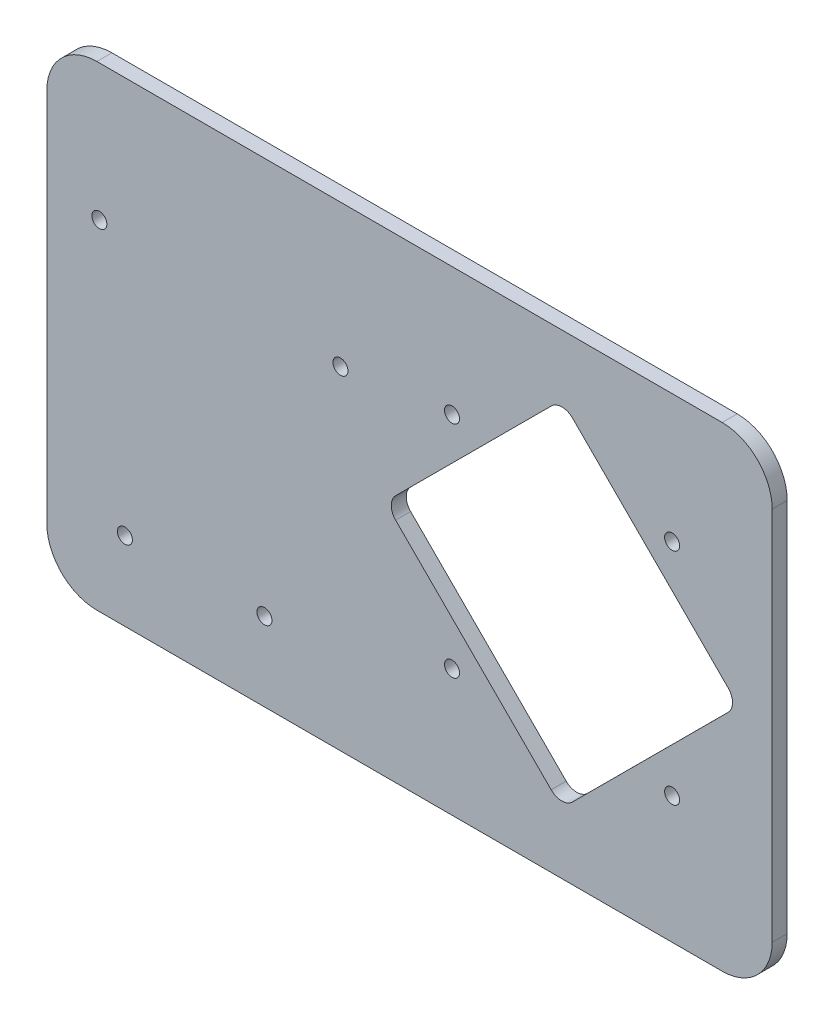
ISO-10303-21;
HEADER;
FILE_DESCRIPTION(('STEP AP214'),'2;1');
FILE_NAME('part.step','',(''),(''),'','','');
FILE_SCHEMA(('AUTOMOTIVE_DESIGN { 1 0 10303 214 1 1 1 1 }'));
ENDSEC;
DATA;
#1=APPLICATION_CONTEXT('core data for automotive mechanical design processes');
#2=APPLICATION_PROTOCOL_DEFINITION('international standard','automotive_design',2000,#1);
#3=PRODUCT_CONTEXT('',#1,'mechanical');
#4=PRODUCT('Part','Part','',(#3));
#5=PRODUCT_RELATED_PRODUCT_CATEGORY('part','',(#4));
#6=PRODUCT_DEFINITION_FORMATION('','',#4);
#7=PRODUCT_DEFINITION_CONTEXT('part definition',#1,'design');
#8=PRODUCT_DEFINITION('design','',#6,#7);
#9=PRODUCT_DEFINITION_SHAPE('','',#8);
#10=(LENGTH_UNIT() NAMED_UNIT(*) SI_UNIT(.MILLI.,.METRE.));
#11=(NAMED_UNIT(*) PLANE_ANGLE_UNIT() SI_UNIT($,.RADIAN.));
#12=(NAMED_UNIT(*) SI_UNIT($,.STERADIAN.) SOLID_ANGLE_UNIT());
#13=UNCERTAINTY_MEASURE_WITH_UNIT(LENGTH_MEASURE(1.E-05),#10,'distance_accuracy_value','');
#14=(GEOMETRIC_REPRESENTATION_CONTEXT(3) GLOBAL_UNCERTAINTY_ASSIGNED_CONTEXT((#13)) GLOBAL_UNIT_ASSIGNED_CONTEXT((#10,
#11,#12)) REPRESENTATION_CONTEXT('',''));
#15=CARTESIAN_POINT('',(0.,0.,0.));
#16=DIRECTION('',(0.,0.,1.));
#17=DIRECTION('',(1.,0.,0.));
#18=AXIS2_PLACEMENT_3D('',#15,#16,#17);
#19=CARTESIAN_POINT('',(108.521309774399,10.,3.));
#20=DIRECTION('',(0.,0.,-1.));
#21=DIRECTION('',(-1.,0.,0.));
#22=AXIS2_PLACEMENT_3D('',#19,#20,#21);
#23=CYLINDRICAL_SURFACE('',#22,10.);
#24=CARTESIAN_POINT('',(108.521309774399,10.,0.));
#25=DIRECTION('',(0.,0.,-1.));
#26=DIRECTION('',(-1.,0.,0.));
#27=AXIS2_PLACEMENT_3D('',#24,#25,#26);
#28=CIRCLE('',#27,10.);
#29=CARTESIAN_POINT('',(118.521309774399,10.,0.));
#30=VERTEX_POINT('',#29);
#31=CARTESIAN_POINT('',(108.521309774399,0.,0.));
#32=VERTEX_POINT('',#31);
#33=EDGE_CURVE('E264',#30,#32,#28,.T.);
#34=ORIENTED_EDGE('',*,*,#33,.F.);
#35=DIRECTION('',(0.,0.,-1.));
#36=VECTOR('',#35,1.);
#37=CARTESIAN_POINT('',(118.521309774399,10.,3.));
#38=LINE('',#37,#36);
#39=CARTESIAN_POINT('',(118.521309774399,10.,3.));
#40=VERTEX_POINT('',#39);
#41=EDGE_CURVE('E11',#40,#30,#38,.T.);
#42=ORIENTED_EDGE('',*,*,#41,.F.);
#43=CARTESIAN_POINT('',(108.521309774399,10.,3.));
#44=DIRECTION('',(0.,0.,-1.));
#45=DIRECTION('',(-1.,0.,0.));
#46=AXIS2_PLACEMENT_3D('',#43,#44,#45);
#47=CIRCLE('',#46,10.);
#48=CARTESIAN_POINT('',(108.521309774399,0.,3.));
#49=VERTEX_POINT('',#48);
#50=EDGE_CURVE('E267',#40,#49,#47,.T.);
#51=ORIENTED_EDGE('',*,*,#50,.T.);
#52=DIRECTION('',(0.,0.,-1.));
#53=VECTOR('',#52,1.);
#54=CARTESIAN_POINT('',(108.521309774399,0.,3.));
#55=LINE('',#54,#53);
#56=EDGE_CURVE('E40',#49,#32,#55,.T.);
#57=ORIENTED_EDGE('',*,*,#56,.T.);
#58=EDGE_LOOP('',(#34,#42,#51,#57));
#59=FACE_BOUND('',#58,.T.);
#60=ADVANCED_FACE('F37',(#59),#23,.T.);
#61=CARTESIAN_POINT('',(118.521309774399,84.99928,3.));
#62=DIRECTION('',(1.,0.,0.));
#63=DIRECTION('',(0.,0.,-1.));
#64=AXIS2_PLACEMENT_3D('',#61,#62,#63);
#65=PLANE('',#64);
#66=DIRECTION('',(0.,-1.,0.));
#67=VECTOR('',#66,1.);
#68=CARTESIAN_POINT('',(118.521309774399,84.99928,0.));
#69=LINE('',#68,#67);
#70=CARTESIAN_POINT('',(118.521309774399,84.99928,0.));
#71=VERTEX_POINT('',#70);
#72=EDGE_CURVE('E271',#71,#30,#69,.T.);
#73=ORIENTED_EDGE('',*,*,#72,.F.);
#74=DIRECTION('',(0.,0.,-1.));
#75=VECTOR('',#74,1.);
#76=CARTESIAN_POINT('',(118.521309774399,84.99928,3.));
#77=LINE('',#76,#75);
#78=CARTESIAN_POINT('',(118.521309774399,84.99928,3.));
#79=VERTEX_POINT('',#78);
#80=EDGE_CURVE('E45',#79,#71,#77,.T.);
#81=ORIENTED_EDGE('',*,*,#80,.F.);
#82=DIRECTION('',(0.,-1.,0.));
#83=VECTOR('',#82,1.);
#84=CARTESIAN_POINT('',(118.521309774399,84.99928,3.));
#85=LINE('',#84,#83);
#86=EDGE_CURVE('E289',#79,#40,#85,.T.);
#87=ORIENTED_EDGE('',*,*,#86,.T.);
#88=ORIENTED_EDGE('',*,*,#41,.T.);
#89=EDGE_LOOP('',(#73,#81,#87,#88));
#90=FACE_BOUND('',#89,.T.);
#91=ADVANCED_FACE('F336',(#90),#65,.T.);
#92=CARTESIAN_POINT('',(108.521309774399,84.99928,3.));
#93=DIRECTION('',(0.,0.,-1.));
#94=DIRECTION('',(-1.,0.,0.));
#95=AXIS2_PLACEMENT_3D('',#92,#93,#94);
#96=CYLINDRICAL_SURFACE('',#95,10.);
#97=CARTESIAN_POINT('',(108.521309774399,84.99928,0.));
#98=DIRECTION('',(0.,0.,-1.));
#99=DIRECTION('',(-1.,0.,0.));
#100=AXIS2_PLACEMENT_3D('',#97,#98,#99);
#101=CIRCLE('',#100,10.);
#102=CARTESIAN_POINT('',(108.521309774399,94.99928,0.));
#103=VERTEX_POINT('',#102);
#104=EDGE_CURVE('E309',#103,#71,#101,.T.);
#105=ORIENTED_EDGE('',*,*,#104,.F.);
#106=DIRECTION('',(0.,0.,-1.));
#107=VECTOR('',#106,1.);
#108=CARTESIAN_POINT('',(108.521309774399,94.99928,3.));
#109=LINE('',#108,#107);
#110=CARTESIAN_POINT('',(108.521309774399,94.99928,3.));
#111=VERTEX_POINT('',#110);
#112=EDGE_CURVE('E315',#111,#103,#109,.T.);
#113=ORIENTED_EDGE('',*,*,#112,.F.);
#114=CARTESIAN_POINT('',(108.521309774399,84.99928,3.));
#115=DIRECTION('',(0.,0.,-1.));
#116=DIRECTION('',(-1.,0.,0.));
#117=AXIS2_PLACEMENT_3D('',#114,#115,#116);
#118=CIRCLE('',#117,10.);
#119=EDGE_CURVE('E286',#111,#79,#118,.T.);
#120=ORIENTED_EDGE('',*,*,#119,.T.);
#121=ORIENTED_EDGE('',*,*,#80,.T.);
#122=EDGE_LOOP('',(#105,#113,#120,#121));
#123=FACE_BOUND('',#122,.T.);
#124=ADVANCED_FACE('F356',(#123),#96,.T.);
#125=CARTESIAN_POINT('',(-16.4786902256012,94.99928,3.));
#126=DIRECTION('',(0.,1.,0.));
#127=DIRECTION('',(0.,0.,1.));
#128=AXIS2_PLACEMENT_3D('',#125,#126,#127);
#129=PLANE('',#128);
#130=DIRECTION('',(1.,0.,0.));
#131=VECTOR('',#130,1.);
#132=CARTESIAN_POINT('',(-16.4786902256012,94.99928,0.));
#133=LINE('',#132,#131);
#134=CARTESIAN_POINT('',(-16.4786902256012,94.99928,0.));
#135=VERTEX_POINT('',#134);
#136=EDGE_CURVE('E306',#135,#103,#133,.T.);
#137=ORIENTED_EDGE('',*,*,#136,.F.);
#138=DIRECTION('',(0.,0.,-1.));
#139=VECTOR('',#138,1.);
#140=CARTESIAN_POINT('',(-16.4786902256012,94.99928,3.));
#141=LINE('',#140,#139);
#142=CARTESIAN_POINT('',(-16.4786902256012,94.99928,3.));
#143=VERTEX_POINT('',#142);
#144=EDGE_CURVE('E317',#143,#135,#141,.T.);
#145=ORIENTED_EDGE('',*,*,#144,.F.);
#146=DIRECTION('',(1.,0.,0.));
#147=VECTOR('',#146,1.);
#148=CARTESIAN_POINT('',(-16.4786902256012,94.99928,3.));
#149=LINE('',#148,#147);
#150=EDGE_CURVE('E283',#143,#111,#149,.T.);
#151=ORIENTED_EDGE('',*,*,#150,.T.);
#152=ORIENTED_EDGE('',*,*,#112,.T.);
#153=EDGE_LOOP('',(#137,#145,#151,#152));
#154=FACE_BOUND('',#153,.T.);
#155=ADVANCED_FACE('F354',(#154),#129,.T.);
#156=CARTESIAN_POINT('',(-16.4786902256013,84.99928,3.));
#157=DIRECTION('',(0.,0.,-1.));
#158=DIRECTION('',(-1.,0.,0.));
#159=AXIS2_PLACEMENT_3D('',#156,#157,#158);
#160=CYLINDRICAL_SURFACE('',#159,10.);
#161=CARTESIAN_POINT('',(-16.4786902256013,84.99928,0.));
#162=DIRECTION('',(0.,0.,-1.));
#163=DIRECTION('',(-1.,0.,0.));
#164=AXIS2_PLACEMENT_3D('',#161,#162,#163);
#165=CIRCLE('',#164,10.);
#166=CARTESIAN_POINT('',(-26.4786902256012,84.99928,0.));
#167=VERTEX_POINT('',#166);
#168=EDGE_CURVE('E303',#167,#135,#165,.T.);
#169=ORIENTED_EDGE('',*,*,#168,.F.);
#170=DIRECTION('',(0.,0.,-1.));
#171=VECTOR('',#170,1.);
#172=CARTESIAN_POINT('',(-26.4786902256012,84.99928,3.));
#173=LINE('',#172,#171);
#174=CARTESIAN_POINT('',(-26.4786902256012,84.99928,3.));
#175=VERTEX_POINT('',#174);
#176=EDGE_CURVE('E319',#175,#167,#173,.T.);
#177=ORIENTED_EDGE('',*,*,#176,.F.);
#178=CARTESIAN_POINT('',(-16.4786902256013,84.99928,3.));
#179=DIRECTION('',(0.,0.,-1.));
#180=DIRECTION('',(-1.,0.,0.));
#181=AXIS2_PLACEMENT_3D('',#178,#179,#180);
#182=CIRCLE('',#181,10.);
#183=EDGE_CURVE('E280',#175,#143,#182,.T.);
#184=ORIENTED_EDGE('',*,*,#183,.T.);
#185=ORIENTED_EDGE('',*,*,#144,.T.);
#186=EDGE_LOOP('',(#169,#177,#184,#185));
#187=FACE_BOUND('',#186,.T.);
#188=ADVANCED_FACE('F350',(#187),#160,.T.);
#189=CARTESIAN_POINT('',(-26.4786902256012,10.,3.));
#190=DIRECTION('',(-1.,0.,0.));
#191=DIRECTION('',(0.,0.,1.));
#192=AXIS2_PLACEMENT_3D('',#189,#190,#191);
#193=PLANE('',#192);
#194=DIRECTION('',(0.,1.,0.));
#195=VECTOR('',#194,1.);
#196=CARTESIAN_POINT('',(-26.4786902256012,10.,0.));
#197=LINE('',#196,#195);
#198=CARTESIAN_POINT('',(-26.4786902256012,10.,0.));
#199=VERTEX_POINT('',#198);
#200=EDGE_CURVE('E300',#199,#167,#197,.T.);
#201=ORIENTED_EDGE('',*,*,#200,.F.);
#202=DIRECTION('',(0.,0.,-1.));
#203=VECTOR('',#202,1.);
#204=CARTESIAN_POINT('',(-26.4786902256012,10.,3.));
#205=LINE('',#204,#203);
#206=CARTESIAN_POINT('',(-26.4786902256012,10.,3.));
#207=VERTEX_POINT('',#206);
#208=EDGE_CURVE('E321',#207,#199,#205,.T.);
#209=ORIENTED_EDGE('',*,*,#208,.F.);
#210=DIRECTION('',(0.,1.,0.));
#211=VECTOR('',#210,1.);
#212=CARTESIAN_POINT('',(-26.4786902256012,10.,3.));
#213=LINE('',#212,#211);
#214=EDGE_CURVE('E277',#207,#175,#213,.T.);
#215=ORIENTED_EDGE('',*,*,#214,.T.);
#216=ORIENTED_EDGE('',*,*,#176,.T.);
#217=EDGE_LOOP('',(#201,#209,#215,#216));
#218=FACE_BOUND('',#217,.T.);
#219=ADVANCED_FACE('F348',(#218),#193,.T.);
#220=CARTESIAN_POINT('',(-16.4786902256013,10.,3.));
#221=DIRECTION('',(0.,0.,-1.));
#222=DIRECTION('',(-1.,0.,0.));
#223=AXIS2_PLACEMENT_3D('',#220,#221,#222);
#224=CYLINDRICAL_SURFACE('',#223,10.);
#225=CARTESIAN_POINT('',(-16.4786902256013,10.,0.));
#226=DIRECTION('',(0.,0.,-1.));
#227=DIRECTION('',(-1.,0.,0.));
#228=AXIS2_PLACEMENT_3D('',#225,#226,#227);
#229=CIRCLE('',#228,10.);
#230=CARTESIAN_POINT('',(-16.4786902256013,0.,0.));
#231=VERTEX_POINT('',#230);
#232=EDGE_CURVE('E297',#231,#199,#229,.T.);
#233=ORIENTED_EDGE('',*,*,#232,.F.);
#234=DIRECTION('',(0.,0.,-1.));
#235=VECTOR('',#234,1.);
#236=CARTESIAN_POINT('',(-16.4786902256013,0.,3.));
#237=LINE('',#236,#235);
#238=CARTESIAN_POINT('',(-16.4786902256013,0.,3.));
#239=VERTEX_POINT('',#238);
#240=EDGE_CURVE('E322',#239,#231,#237,.T.);
#241=ORIENTED_EDGE('',*,*,#240,.F.);
#242=CARTESIAN_POINT('',(-16.4786902256013,10.,3.));
#243=DIRECTION('',(0.,0.,-1.));
#244=DIRECTION('',(-1.,0.,0.));
#245=AXIS2_PLACEMENT_3D('',#242,#243,#244);
#246=CIRCLE('',#245,10.);
#247=EDGE_CURVE('E274',#239,#207,#246,.T.);
#248=ORIENTED_EDGE('',*,*,#247,.T.);
#249=ORIENTED_EDGE('',*,*,#208,.T.);
#250=EDGE_LOOP('',(#233,#241,#248,#249));
#251=FACE_BOUND('',#250,.T.);
#252=ADVANCED_FACE('F344',(#251),#224,.T.);
#253=CARTESIAN_POINT('',(108.521309774399,0.,3.));
#254=DIRECTION('',(0.,-1.,0.));
#255=DIRECTION('',(0.,0.,-1.));
#256=AXIS2_PLACEMENT_3D('',#253,#254,#255);
#257=PLANE('',#256);
#258=DIRECTION('',(-1.,0.,0.));
#259=VECTOR('',#258,1.);
#260=CARTESIAN_POINT('',(108.521309774399,0.,0.));
#261=LINE('',#260,#259);
#262=EDGE_CURVE('E294',#32,#231,#261,.T.);
#263=ORIENTED_EDGE('',*,*,#262,.F.);
#264=ORIENTED_EDGE('',*,*,#56,.F.);
#265=DIRECTION('',(-1.,0.,0.));
#266=VECTOR('',#265,1.);
#267=CARTESIAN_POINT('',(108.521309774399,0.,3.));
#268=LINE('',#267,#266);
#269=EDGE_CURVE('E270',#49,#239,#268,.T.);
#270=ORIENTED_EDGE('',*,*,#269,.T.);
#271=ORIENTED_EDGE('',*,*,#240,.T.);
#272=EDGE_LOOP('',(#263,#264,#270,#271));
#273=FACE_BOUND('',#272,.T.);
#274=ADVANCED_FACE('F330',(#273),#257,.T.);
#275=CARTESIAN_POINT('',(108.521309774399,10.,3.));
#276=DIRECTION('',(0.,0.,-1.));
#277=DIRECTION('',(-1.,0.,0.));
#278=AXIS2_PLACEMENT_3D('',#275,#276,#277);
#279=PLANE('',#278);
#280=DIRECTION('',(0.706685062660328,-0.707528248349681,0.));
#281=VECTOR('',#280,1.);
#282=CARTESIAN_POINT('',(109.719554184932,49.6555218048033,3.));
#283=LINE('',#282,#281);
#284=CARTESIAN_POINT('',(78.6256123616023,80.7865635587188,3.));
#285=VERTEX_POINT('',#284);
#286=CARTESIAN_POINT('',(109.719554184932,49.6555218048033,3.));
#287=VERTEX_POINT('',#286);
#288=EDGE_CURVE('E158',#285,#287,#283,.T.);
#289=ORIENTED_EDGE('',*,*,#288,.T.);
#290=CARTESIAN_POINT('',(107.596969439883,47.5354666168224,3.));
#291=DIRECTION('',(0.,0.,-1.));
#292=DIRECTION('',(1.,0.,0.));
#293=AXIS2_PLACEMENT_3D('',#290,#291,#292);
#294=CIRCLE('',#293,2.99999999999998);
#295=CARTESIAN_POINT('',(109.717024627864,45.4128818717733,3.));
#296=VERTEX_POINT('',#295);
#297=EDGE_CURVE('E152',#287,#296,#294,.T.);
#298=ORIENTED_EDGE('',*,*,#297,.T.);
#299=DIRECTION('',(-0.707528248349681,-0.706685062660328,0.));
#300=VECTOR('',#299,1.);
#301=CARTESIAN_POINT('',(78.5857208717542,14.3186783584871,3.));
#302=LINE('',#301,#300);
#303=CARTESIAN_POINT('',(78.5857208717542,14.3186783584871,3.));
#304=VERTEX_POINT('',#303);
#305=EDGE_CURVE('E161',#296,#304,#302,.T.);
#306=ORIENTED_EDGE('',*,*,#305,.T.);
#307=CARTESIAN_POINT('',(76.4656656837732,16.4412631035361,3.));
#308=DIRECTION('',(0.,0.,-1.));
#309=DIRECTION('',(1.,0.,0.));
#310=AXIS2_PLACEMENT_3D('',#307,#308,#309);
#311=CIRCLE('',#310,3.00000000000001);
#312=CARTESIAN_POINT('',(74.3430809387241,14.3212079155551,3.));
#313=VERTEX_POINT('',#312);
#314=EDGE_CURVE('E53',#304,#313,#311,.T.);
#315=ORIENTED_EDGE('',*,*,#314,.T.);
#316=DIRECTION('',(-0.706685062660328,0.707528248349681,0.));
#317=VECTOR('',#316,1.);
#318=CARTESIAN_POINT('',(43.2491391153948,45.4522496694706,3.));
#319=LINE('',#318,#317);
#320=CARTESIAN_POINT('',(43.2491391153948,45.4522496694706,3.));
#321=VERTEX_POINT('',#320);
#322=EDGE_CURVE('E176',#313,#321,#319,.T.);
#323=ORIENTED_EDGE('',*,*,#322,.T.);
#324=CARTESIAN_POINT('',(45.3717238604438,47.5723048574516,3.));
#325=DIRECTION('',(0.,0.,-1.));
#326=DIRECTION('',(1.,0.,0.));
#327=AXIS2_PLACEMENT_3D('',#324,#325,#326);
#328=CIRCLE('',#327,3.);
#329=CARTESIAN_POINT('',(43.2516686724628,49.6948896025007,3.));
#330=VERTEX_POINT('',#329);
#331=EDGE_CURVE('E179',#321,#330,#328,.T.);
#332=ORIENTED_EDGE('',*,*,#331,.T.);
#333=DIRECTION('',(0.70752824834968,0.706685062660329,0.));
#334=VECTOR('',#333,1.);
#335=CARTESIAN_POINT('',(74.3829724285722,80.7890931157869,3.));
#336=LINE('',#335,#334);
#337=CARTESIAN_POINT('',(74.3829724285722,80.7890931157869,3.));
#338=VERTEX_POINT('',#337);
#339=EDGE_CURVE('E182',#330,#338,#336,.T.);
#340=ORIENTED_EDGE('',*,*,#339,.T.);
#341=CARTESIAN_POINT('',(76.5030276165532,78.6665083707379,3.));
#342=DIRECTION('',(0.,0.,-1.));
#343=DIRECTION('',(1.,0.,0.));
#344=AXIS2_PLACEMENT_3D('',#341,#342,#343);
#345=CIRCLE('',#344,2.99999999999998);
#346=EDGE_CURVE('E185',#338,#285,#345,.T.);
#347=ORIENTED_EDGE('',*,*,#346,.T.);
#348=EDGE_LOOP('',(#289,#298,#306,#315,#323,#332,#340,#347));
#349=FACE_BOUND('',#348,.T.);
#350=CARTESIAN_POINT('',(17.0213097743988,15.715045329957,3.));
#351=DIRECTION('',(0.,0.,-1.));
#352=DIRECTION('',(1.,0.,0.));
#353=AXIS2_PLACEMENT_3D('',#350,#351,#352);
#354=CIRCLE('',#353,1.5);
#355=CARTESIAN_POINT('',(18.5213097743988,15.715045329957,3.));
#356=VERTEX_POINT('',#355);
#357=EDGE_CURVE('E219',#356,#356,#354,.T.);
#358=ORIENTED_EDGE('',*,*,#357,.T.);
#359=EDGE_LOOP('',(#358));
#360=FACE_BOUND('',#359,.T.);
#361=CARTESIAN_POINT('',(54.5213097743988,25.375145329957,3.));
#362=DIRECTION('',(0.,0.,-1.));
#363=DIRECTION('',(1.,0.,0.));
#364=AXIS2_PLACEMENT_3D('',#361,#362,#363);
#365=CIRCLE('',#364,1.5);
#366=CARTESIAN_POINT('',(56.0213097743988,25.375145329957,3.));
#367=VERTEX_POINT('',#366);
#368=EDGE_CURVE('E225',#367,#367,#365,.T.);
#369=ORIENTED_EDGE('',*,*,#368,.T.);
#370=EDGE_LOOP('',(#369));
#371=FACE_BOUND('',#370,.T.);
#372=CARTESIAN_POINT('',(98.5203097743989,25.375145329957,3.));
#373=DIRECTION('',(0.,0.,-1.));
#374=DIRECTION('',(1.,0.,0.));
#375=AXIS2_PLACEMENT_3D('',#372,#373,#374);
#376=CIRCLE('',#375,1.5);
#377=CARTESIAN_POINT('',(100.020309774399,25.375145329957,3.));
#378=VERTEX_POINT('',#377);
#379=EDGE_CURVE('E231',#378,#378,#376,.T.);
#380=ORIENTED_EDGE('',*,*,#379,.T.);
#381=EDGE_LOOP('',(#380));
#382=FACE_BOUND('',#381,.T.);
#383=CARTESIAN_POINT('',(98.5203097743988,69.375945329957,3.));
#384=DIRECTION('',(0.,0.,-1.));
#385=DIRECTION('',(1.,0.,0.));
#386=AXIS2_PLACEMENT_3D('',#383,#384,#385);
#387=CIRCLE('',#386,1.5);
#388=CARTESIAN_POINT('',(100.020309774399,69.375945329957,3.));
#389=VERTEX_POINT('',#388);
#390=EDGE_CURVE('E237',#389,#389,#387,.T.);
#391=ORIENTED_EDGE('',*,*,#390,.T.);
#392=EDGE_LOOP('',(#391));
#393=FACE_BOUND('',#392,.T.);
#394=CARTESIAN_POINT('',(54.5213097743988,69.375945329957,3.));
#395=DIRECTION('',(0.,0.,-1.));
#396=DIRECTION('',(1.,0.,0.));
#397=AXIS2_PLACEMENT_3D('',#394,#395,#396);
#398=CIRCLE('',#397,1.5);
#399=CARTESIAN_POINT('',(56.0213097743988,69.375945329957,3.));
#400=VERTEX_POINT('',#399);
#401=EDGE_CURVE('E243',#400,#400,#398,.T.);
#402=ORIENTED_EDGE('',*,*,#401,.T.);
#403=EDGE_LOOP('',(#402));
#404=FACE_BOUND('',#403,.T.);
#405=CARTESIAN_POINT('',(-10.8786902256012,15.715045329957,3.));
#406=DIRECTION('',(0.,0.,-1.));
#407=DIRECTION('',(1.,0.,0.));
#408=AXIS2_PLACEMENT_3D('',#405,#406,#407);
#409=CIRCLE('',#408,1.5);
#410=CARTESIAN_POINT('',(-9.3786902256012,15.715045329957,3.));
#411=VERTEX_POINT('',#410);
#412=EDGE_CURVE('E249',#411,#411,#409,.T.);
#413=ORIENTED_EDGE('',*,*,#412,.T.);
#414=EDGE_LOOP('',(#413));
#415=FACE_BOUND('',#414,.T.);
#416=CARTESIAN_POINT('',(32.2203097743988,66.515245329957,3.));
#417=DIRECTION('',(0.,0.,-1.));
#418=DIRECTION('',(1.,0.,0.));
#419=AXIS2_PLACEMENT_3D('',#416,#417,#418);
#420=CIRCLE('',#419,1.5);
#421=CARTESIAN_POINT('',(33.7203097743988,66.515245329957,3.));
#422=VERTEX_POINT('',#421);
#423=EDGE_CURVE('E255',#422,#422,#420,.T.);
#424=ORIENTED_EDGE('',*,*,#423,.T.);
#425=EDGE_LOOP('',(#424));
#426=FACE_BOUND('',#425,.T.);
#427=CARTESIAN_POINT('',(-15.9786902256012,67.814545329957,3.));
#428=DIRECTION('',(0.,0.,-1.));
#429=DIRECTION('',(1.,0.,0.));
#430=AXIS2_PLACEMENT_3D('',#427,#428,#429);
#431=CIRCLE('',#430,1.5);
#432=CARTESIAN_POINT('',(-14.4786902256012,67.814545329957,3.));
#433=VERTEX_POINT('',#432);
#434=EDGE_CURVE('E261',#433,#433,#431,.T.);
#435=ORIENTED_EDGE('',*,*,#434,.T.);
#436=EDGE_LOOP('',(#435));
#437=FACE_BOUND('',#436,.T.);
#438=ORIENTED_EDGE('',*,*,#50,.F.);
#439=ORIENTED_EDGE('',*,*,#86,.F.);
#440=ORIENTED_EDGE('',*,*,#119,.F.);
#441=ORIENTED_EDGE('',*,*,#150,.F.);
#442=ORIENTED_EDGE('',*,*,#183,.F.);
#443=ORIENTED_EDGE('',*,*,#214,.F.);
#444=ORIENTED_EDGE('',*,*,#247,.F.);
#445=ORIENTED_EDGE('',*,*,#269,.F.);
#446=EDGE_LOOP('',(#438,#439,#440,#441,#442,#443,#444,#445));
#447=FACE_BOUND('',#446,.T.);
#448=ADVANCED_FACE('F165',(#349,#360,#371,#382,#393,#404,#415,#426,#437,#447),#279,.F.);
#449=CARTESIAN_POINT('',(108.521309774399,10.,0.));
#450=DIRECTION('',(0.,0.,-1.));
#451=DIRECTION('',(-1.,0.,0.));
#452=AXIS2_PLACEMENT_3D('',#449,#450,#451);
#453=PLANE('',#452);
#454=CARTESIAN_POINT('',(107.596969439883,47.5354666168224,0.));
#455=DIRECTION('',(0.,0.,-1.));
#456=DIRECTION('',(1.,0.,0.));
#457=AXIS2_PLACEMENT_3D('',#454,#455,#456);
#458=CIRCLE('',#457,2.99999999999998);
#459=CARTESIAN_POINT('',(109.719554184932,49.6555218048033,0.));
#460=VERTEX_POINT('',#459);
#461=CARTESIAN_POINT('',(109.717024627864,45.4128818717733,0.));
#462=VERTEX_POINT('',#461);
#463=EDGE_CURVE('E61',#460,#462,#458,.T.);
#464=ORIENTED_EDGE('',*,*,#463,.F.);
#465=DIRECTION('',(0.706685062660328,-0.707528248349681,0.));
#466=VECTOR('',#465,1.);
#467=CARTESIAN_POINT('',(109.719554184932,49.6555218048033,0.));
#468=LINE('',#467,#466);
#469=CARTESIAN_POINT('',(78.6256123616023,80.7865635587188,0.));
#470=VERTEX_POINT('',#469);
#471=EDGE_CURVE('E169',#470,#460,#468,.T.);
#472=ORIENTED_EDGE('',*,*,#471,.F.);
#473=CARTESIAN_POINT('',(76.5030276165532,78.6665083707379,0.));
#474=DIRECTION('',(0.,0.,-1.));
#475=DIRECTION('',(1.,0.,0.));
#476=AXIS2_PLACEMENT_3D('',#473,#474,#475);
#477=CIRCLE('',#476,2.99999999999998);
#478=CARTESIAN_POINT('',(74.3829724285722,80.7890931157869,0.));
#479=VERTEX_POINT('',#478);
#480=EDGE_CURVE('E172',#479,#470,#477,.T.);
#481=ORIENTED_EDGE('',*,*,#480,.F.);
#482=DIRECTION('',(0.70752824834968,0.706685062660329,0.));
#483=VECTOR('',#482,1.);
#484=CARTESIAN_POINT('',(74.3829724285722,80.7890931157869,0.));
#485=LINE('',#484,#483);
#486=CARTESIAN_POINT('',(43.2516686724628,49.6948896025007,0.));
#487=VERTEX_POINT('',#486);
#488=EDGE_CURVE('E200',#487,#479,#485,.T.);
#489=ORIENTED_EDGE('',*,*,#488,.F.);
#490=CARTESIAN_POINT('',(45.3717238604438,47.5723048574516,0.));
#491=DIRECTION('',(0.,0.,-1.));
#492=DIRECTION('',(1.,0.,0.));
#493=AXIS2_PLACEMENT_3D('',#490,#491,#492);
#494=CIRCLE('',#493,3.);
#495=CARTESIAN_POINT('',(43.2491391153948,45.4522496694706,0.));
#496=VERTEX_POINT('',#495);
#497=EDGE_CURVE('E197',#496,#487,#494,.T.);
#498=ORIENTED_EDGE('',*,*,#497,.F.);
#499=DIRECTION('',(-0.706685062660328,0.707528248349681,0.));
#500=VECTOR('',#499,1.);
#501=CARTESIAN_POINT('',(43.2491391153948,45.4522496694706,0.));
#502=LINE('',#501,#500);
#503=CARTESIAN_POINT('',(74.3430809387241,14.3212079155551,0.));
#504=VERTEX_POINT('',#503);
#505=EDGE_CURVE('E194',#504,#496,#502,.T.);
#506=ORIENTED_EDGE('',*,*,#505,.F.);
#507=CARTESIAN_POINT('',(76.4656656837732,16.4412631035361,0.));
#508=DIRECTION('',(0.,0.,-1.));
#509=DIRECTION('',(1.,0.,0.));
#510=AXIS2_PLACEMENT_3D('',#507,#508,#509);
#511=CIRCLE('',#510,3.00000000000001);
#512=CARTESIAN_POINT('',(78.5857208717542,14.3186783584871,0.));
#513=VERTEX_POINT('',#512);
#514=EDGE_CURVE('E191',#513,#504,#511,.T.);
#515=ORIENTED_EDGE('',*,*,#514,.F.);
#516=DIRECTION('',(-0.707528248349681,-0.706685062660328,0.));
#517=VECTOR('',#516,1.);
#518=CARTESIAN_POINT('',(78.5857208717542,14.3186783584871,0.));
#519=LINE('',#518,#517);
#520=EDGE_CURVE('E189',#462,#513,#519,.T.);
#521=ORIENTED_EDGE('',*,*,#520,.F.);
#522=EDGE_LOOP('',(#464,#472,#481,#489,#498,#506,#515,#521));
#523=FACE_BOUND('',#522,.T.);
#524=CARTESIAN_POINT('',(17.0213097743988,15.715045329957,0.));
#525=DIRECTION('',(0.,0.,-1.));
#526=DIRECTION('',(1.,0.,0.));
#527=AXIS2_PLACEMENT_3D('',#524,#525,#526);
#528=CIRCLE('',#527,1.5);
#529=CARTESIAN_POINT('',(18.5213097743988,15.715045329957,0.));
#530=VERTEX_POINT('',#529);
#531=EDGE_CURVE('E207',#530,#530,#528,.T.);
#532=ORIENTED_EDGE('',*,*,#531,.F.);
#533=EDGE_LOOP('',(#532));
#534=FACE_BOUND('',#533,.T.);
#535=CARTESIAN_POINT('',(54.5213097743988,25.375145329957,0.));
#536=DIRECTION('',(0.,0.,-1.));
#537=DIRECTION('',(1.,0.,0.));
#538=AXIS2_PLACEMENT_3D('',#535,#536,#537);
#539=CIRCLE('',#538,1.5);
#540=CARTESIAN_POINT('',(56.0213097743988,25.375145329957,0.));
#541=VERTEX_POINT('',#540);
#542=EDGE_CURVE('E222',#541,#541,#539,.T.);
#543=ORIENTED_EDGE('',*,*,#542,.F.);
#544=EDGE_LOOP('',(#543));
#545=FACE_BOUND('',#544,.T.);
#546=CARTESIAN_POINT('',(98.5203097743989,25.375145329957,0.));
#547=DIRECTION('',(0.,0.,-1.));
#548=DIRECTION('',(1.,0.,0.));
#549=AXIS2_PLACEMENT_3D('',#546,#547,#548);
#550=CIRCLE('',#549,1.5);
#551=CARTESIAN_POINT('',(100.020309774399,25.375145329957,0.));
#552=VERTEX_POINT('',#551);
#553=EDGE_CURVE('E228',#552,#552,#550,.T.);
#554=ORIENTED_EDGE('',*,*,#553,.F.);
#555=EDGE_LOOP('',(#554));
#556=FACE_BOUND('',#555,.T.);
#557=CARTESIAN_POINT('',(98.5203097743988,69.375945329957,0.));
#558=DIRECTION('',(0.,0.,-1.));
#559=DIRECTION('',(1.,0.,0.));
#560=AXIS2_PLACEMENT_3D('',#557,#558,#559);
#561=CIRCLE('',#560,1.5);
#562=CARTESIAN_POINT('',(100.020309774399,69.375945329957,0.));
#563=VERTEX_POINT('',#562);
#564=EDGE_CURVE('E234',#563,#563,#561,.T.);
#565=ORIENTED_EDGE('',*,*,#564,.F.);
#566=EDGE_LOOP('',(#565));
#567=FACE_BOUND('',#566,.T.);
#568=CARTESIAN_POINT('',(54.5213097743988,69.375945329957,0.));
#569=DIRECTION('',(0.,0.,-1.));
#570=DIRECTION('',(1.,0.,0.));
#571=AXIS2_PLACEMENT_3D('',#568,#569,#570);
#572=CIRCLE('',#571,1.5);
#573=CARTESIAN_POINT('',(56.0213097743988,69.375945329957,0.));
#574=VERTEX_POINT('',#573);
#575=EDGE_CURVE('E240',#574,#574,#572,.T.);
#576=ORIENTED_EDGE('',*,*,#575,.F.);
#577=EDGE_LOOP('',(#576));
#578=FACE_BOUND('',#577,.T.);
#579=CARTESIAN_POINT('',(-10.8786902256012,15.715045329957,0.));
#580=DIRECTION('',(0.,0.,-1.));
#581=DIRECTION('',(1.,0.,0.));
#582=AXIS2_PLACEMENT_3D('',#579,#580,#581);
#583=CIRCLE('',#582,1.5);
#584=CARTESIAN_POINT('',(-9.3786902256012,15.715045329957,0.));
#585=VERTEX_POINT('',#584);
#586=EDGE_CURVE('E246',#585,#585,#583,.T.);
#587=ORIENTED_EDGE('',*,*,#586,.F.);
#588=EDGE_LOOP('',(#587));
#589=FACE_BOUND('',#588,.T.);
#590=CARTESIAN_POINT('',(32.2203097743988,66.515245329957,0.));
#591=DIRECTION('',(0.,0.,-1.));
#592=DIRECTION('',(1.,0.,0.));
#593=AXIS2_PLACEMENT_3D('',#590,#591,#592);
#594=CIRCLE('',#593,1.5);
#595=CARTESIAN_POINT('',(33.7203097743988,66.515245329957,0.));
#596=VERTEX_POINT('',#595);
#597=EDGE_CURVE('E252',#596,#596,#594,.T.);
#598=ORIENTED_EDGE('',*,*,#597,.F.);
#599=EDGE_LOOP('',(#598));
#600=FACE_BOUND('',#599,.T.);
#601=CARTESIAN_POINT('',(-15.9786902256012,67.814545329957,0.));
#602=DIRECTION('',(0.,0.,-1.));
#603=DIRECTION('',(1.,0.,0.));
#604=AXIS2_PLACEMENT_3D('',#601,#602,#603);
#605=CIRCLE('',#604,1.5);
#606=CARTESIAN_POINT('',(-14.4786902256012,67.814545329957,0.));
#607=VERTEX_POINT('',#606);
#608=EDGE_CURVE('E258',#607,#607,#605,.T.);
#609=ORIENTED_EDGE('',*,*,#608,.F.);
#610=EDGE_LOOP('',(#609));
#611=FACE_BOUND('',#610,.T.);
#612=ORIENTED_EDGE('',*,*,#33,.T.);
#613=ORIENTED_EDGE('',*,*,#262,.T.);
#614=ORIENTED_EDGE('',*,*,#232,.T.);
#615=ORIENTED_EDGE('',*,*,#200,.T.);
#616=ORIENTED_EDGE('',*,*,#168,.T.);
#617=ORIENTED_EDGE('',*,*,#136,.T.);
#618=ORIENTED_EDGE('',*,*,#104,.T.);
#619=ORIENTED_EDGE('',*,*,#72,.T.);
#620=EDGE_LOOP('',(#612,#613,#614,#615,#616,#617,#618,#619));
#621=FACE_BOUND('',#620,.T.);
#622=ADVANCED_FACE('F332',(#523,#534,#545,#556,#567,#578,#589,#600,#611,#621),#453,.T.);
#623=CARTESIAN_POINT('',(-15.9786902256012,67.814545329957,3.));
#624=DIRECTION('',(0.,0.,-1.));
#625=DIRECTION('',(-1.,0.,0.));
#626=AXIS2_PLACEMENT_3D('',#623,#624,#625);
#627=CYLINDRICAL_SURFACE('',#626,1.5);
#628=ORIENTED_EDGE('',*,*,#434,.F.);
#629=EDGE_LOOP('',(#628));
#630=FACE_BOUND('',#629,.T.);
#631=ORIENTED_EDGE('',*,*,#608,.T.);
#632=EDGE_LOOP('',(#631));
#633=FACE_BOUND('',#632,.T.);
#634=ADVANCED_FACE('F430',(#630,#633),#627,.F.);
#635=CARTESIAN_POINT('',(32.2203097743988,66.515245329957,3.));
#636=DIRECTION('',(0.,0.,-1.));
#637=DIRECTION('',(-1.,0.,0.));
#638=AXIS2_PLACEMENT_3D('',#635,#636,#637);
#639=CYLINDRICAL_SURFACE('',#638,1.5);
#640=ORIENTED_EDGE('',*,*,#423,.F.);
#641=EDGE_LOOP('',(#640));
#642=FACE_BOUND('',#641,.T.);
#643=ORIENTED_EDGE('',*,*,#597,.T.);
#644=EDGE_LOOP('',(#643));
#645=FACE_BOUND('',#644,.T.);
#646=ADVANCED_FACE('F440',(#642,#645),#639,.F.);
#647=CARTESIAN_POINT('',(-10.8786902256012,15.715045329957,3.));
#648=DIRECTION('',(0.,0.,-1.));
#649=DIRECTION('',(-1.,0.,0.));
#650=AXIS2_PLACEMENT_3D('',#647,#648,#649);
#651=CYLINDRICAL_SURFACE('',#650,1.5);
#652=ORIENTED_EDGE('',*,*,#412,.F.);
#653=EDGE_LOOP('',(#652));
#654=FACE_BOUND('',#653,.T.);
#655=ORIENTED_EDGE('',*,*,#586,.T.);
#656=EDGE_LOOP('',(#655));
#657=FACE_BOUND('',#656,.T.);
#658=ADVANCED_FACE('F450',(#654,#657),#651,.F.);
#659=CARTESIAN_POINT('',(54.5213097743988,69.375945329957,3.));
#660=DIRECTION('',(0.,0.,-1.));
#661=DIRECTION('',(-1.,0.,0.));
#662=AXIS2_PLACEMENT_3D('',#659,#660,#661);
#663=CYLINDRICAL_SURFACE('',#662,1.5);
#664=ORIENTED_EDGE('',*,*,#401,.F.);
#665=EDGE_LOOP('',(#664));
#666=FACE_BOUND('',#665,.T.);
#667=ORIENTED_EDGE('',*,*,#575,.T.);
#668=EDGE_LOOP('',(#667));
#669=FACE_BOUND('',#668,.T.);
#670=ADVANCED_FACE('F460',(#666,#669),#663,.F.);
#671=CARTESIAN_POINT('',(98.5203097743988,69.375945329957,3.));
#672=DIRECTION('',(0.,0.,-1.));
#673=DIRECTION('',(-1.,0.,0.));
#674=AXIS2_PLACEMENT_3D('',#671,#672,#673);
#675=CYLINDRICAL_SURFACE('',#674,1.5);
#676=ORIENTED_EDGE('',*,*,#390,.F.);
#677=EDGE_LOOP('',(#676));
#678=FACE_BOUND('',#677,.T.);
#679=ORIENTED_EDGE('',*,*,#564,.T.);
#680=EDGE_LOOP('',(#679));
#681=FACE_BOUND('',#680,.T.);
#682=ADVANCED_FACE('F470',(#678,#681),#675,.F.);
#683=CARTESIAN_POINT('',(98.5203097743989,25.375145329957,3.));
#684=DIRECTION('',(0.,0.,-1.));
#685=DIRECTION('',(-1.,0.,0.));
#686=AXIS2_PLACEMENT_3D('',#683,#684,#685);
#687=CYLINDRICAL_SURFACE('',#686,1.5);
#688=ORIENTED_EDGE('',*,*,#379,.F.);
#689=EDGE_LOOP('',(#688));
#690=FACE_BOUND('',#689,.T.);
#691=ORIENTED_EDGE('',*,*,#553,.T.);
#692=EDGE_LOOP('',(#691));
#693=FACE_BOUND('',#692,.T.);
#694=ADVANCED_FACE('F480',(#690,#693),#687,.F.);
#695=CARTESIAN_POINT('',(54.5213097743988,25.375145329957,3.));
#696=DIRECTION('',(0.,0.,-1.));
#697=DIRECTION('',(-1.,0.,0.));
#698=AXIS2_PLACEMENT_3D('',#695,#696,#697);
#699=CYLINDRICAL_SURFACE('',#698,1.5);
#700=ORIENTED_EDGE('',*,*,#368,.F.);
#701=EDGE_LOOP('',(#700));
#702=FACE_BOUND('',#701,.T.);
#703=ORIENTED_EDGE('',*,*,#542,.T.);
#704=EDGE_LOOP('',(#703));
#705=FACE_BOUND('',#704,.T.);
#706=ADVANCED_FACE('F490',(#702,#705),#699,.F.);
#707=CARTESIAN_POINT('',(17.0213097743988,15.715045329957,3.));
#708=DIRECTION('',(0.,0.,-1.));
#709=DIRECTION('',(-1.,0.,0.));
#710=AXIS2_PLACEMENT_3D('',#707,#708,#709);
#711=CYLINDRICAL_SURFACE('',#710,1.5);
#712=ORIENTED_EDGE('',*,*,#357,.F.);
#713=EDGE_LOOP('',(#712));
#714=FACE_BOUND('',#713,.T.);
#715=ORIENTED_EDGE('',*,*,#531,.T.);
#716=EDGE_LOOP('',(#715));
#717=FACE_BOUND('',#716,.T.);
#718=ADVANCED_FACE('F500',(#714,#717),#711,.F.);
#719=CARTESIAN_POINT('',(107.596969439883,47.5354666168224,3.));
#720=DIRECTION('',(0.,0.,-1.));
#721=DIRECTION('',(-1.,0.,0.));
#722=AXIS2_PLACEMENT_3D('',#719,#720,#721);
#723=CYLINDRICAL_SURFACE('',#722,2.99999999999998);
#724=ORIENTED_EDGE('',*,*,#463,.T.);
#725=DIRECTION('',(0.,0.,-1.));
#726=VECTOR('',#725,1.);
#727=CARTESIAN_POINT('',(109.717024627864,45.4128818717733,3.));
#728=LINE('',#727,#726);
#729=EDGE_CURVE('E148',#296,#462,#728,.T.);
#730=ORIENTED_EDGE('',*,*,#729,.F.);
#731=ORIENTED_EDGE('',*,*,#297,.F.);
#732=DIRECTION('',(0.,0.,-1.));
#733=VECTOR('',#732,1.);
#734=CARTESIAN_POINT('',(109.719554184932,49.6555218048033,3.));
#735=LINE('',#734,#733);
#736=EDGE_CURVE('E205',#287,#460,#735,.T.);
#737=ORIENTED_EDGE('',*,*,#736,.T.);
#738=EDGE_LOOP('',(#724,#730,#731,#737));
#739=FACE_BOUND('',#738,.T.);
#740=ADVANCED_FACE('F150',(#739),#723,.F.);
#741=CARTESIAN_POINT('',(109.719554184932,49.6555218048033,3.));
#742=DIRECTION('',(0.707528248349681,0.706685062660328,0.));
#743=DIRECTION('',(-0.706685062660328,0.707528248349681,0.));
#744=AXIS2_PLACEMENT_3D('',#741,#742,#743);
#745=PLANE('',#744);
#746=ORIENTED_EDGE('',*,*,#471,.T.);
#747=ORIENTED_EDGE('',*,*,#736,.F.);
#748=ORIENTED_EDGE('',*,*,#288,.F.);
#749=DIRECTION('',(0.,0.,-1.));
#750=VECTOR('',#749,1.);
#751=CARTESIAN_POINT('',(78.6256123616023,80.7865635587188,3.));
#752=LINE('',#751,#750);
#753=EDGE_CURVE('E208',#285,#470,#752,.T.);
#754=ORIENTED_EDGE('',*,*,#753,.T.);
#755=EDGE_LOOP('',(#746,#747,#748,#754));
#756=FACE_BOUND('',#755,.T.);
#757=ADVANCED_FACE('F519',(#756),#745,.F.);
#758=CARTESIAN_POINT('',(76.5030276165532,78.6665083707379,3.));
#759=DIRECTION('',(0.,0.,-1.));
#760=DIRECTION('',(-1.,0.,0.));
#761=AXIS2_PLACEMENT_3D('',#758,#759,#760);
#762=CYLINDRICAL_SURFACE('',#761,2.99999999999998);
#763=ORIENTED_EDGE('',*,*,#480,.T.);
#764=ORIENTED_EDGE('',*,*,#753,.F.);
#765=ORIENTED_EDGE('',*,*,#346,.F.);
#766=DIRECTION('',(0.,0.,-1.));
#767=VECTOR('',#766,1.);
#768=CARTESIAN_POINT('',(74.3829724285722,80.7890931157869,3.));
#769=LINE('',#768,#767);
#770=EDGE_CURVE('E210',#338,#479,#769,.T.);
#771=ORIENTED_EDGE('',*,*,#770,.T.);
#772=EDGE_LOOP('',(#763,#764,#765,#771));
#773=FACE_BOUND('',#772,.T.);
#774=ADVANCED_FACE('F528',(#773),#762,.F.);
#775=CARTESIAN_POINT('',(74.3829724285722,80.7890931157869,3.));
#776=DIRECTION('',(-0.706685062660329,0.707528248349681,0.));
#777=DIRECTION('',(-0.707528248349681,-0.706685062660329,0.));
#778=AXIS2_PLACEMENT_3D('',#775,#776,#777);
#779=PLANE('',#778);
#780=ORIENTED_EDGE('',*,*,#488,.T.);
#781=ORIENTED_EDGE('',*,*,#770,.F.);
#782=ORIENTED_EDGE('',*,*,#339,.F.);
#783=DIRECTION('',(0.,0.,-1.));
#784=VECTOR('',#783,1.);
#785=CARTESIAN_POINT('',(43.2516686724628,49.6948896025007,3.));
#786=LINE('',#785,#784);
#787=EDGE_CURVE('E212',#330,#487,#786,.T.);
#788=ORIENTED_EDGE('',*,*,#787,.T.);
#789=EDGE_LOOP('',(#780,#781,#782,#788));
#790=FACE_BOUND('',#789,.T.);
#791=ADVANCED_FACE('F538',(#790),#779,.F.);
#792=CARTESIAN_POINT('',(45.3717238604438,47.5723048574516,3.));
#793=DIRECTION('',(0.,0.,-1.));
#794=DIRECTION('',(-1.,0.,0.));
#795=AXIS2_PLACEMENT_3D('',#792,#793,#794);
#796=CYLINDRICAL_SURFACE('',#795,3.);
#797=ORIENTED_EDGE('',*,*,#497,.T.);
#798=ORIENTED_EDGE('',*,*,#787,.F.);
#799=ORIENTED_EDGE('',*,*,#331,.F.);
#800=DIRECTION('',(0.,0.,-1.));
#801=VECTOR('',#800,1.);
#802=CARTESIAN_POINT('',(43.2491391153948,45.4522496694706,3.));
#803=LINE('',#802,#801);
#804=EDGE_CURVE('E214',#321,#496,#803,.T.);
#805=ORIENTED_EDGE('',*,*,#804,.T.);
#806=EDGE_LOOP('',(#797,#798,#799,#805));
#807=FACE_BOUND('',#806,.T.);
#808=ADVANCED_FACE('F548',(#807),#796,.F.);
#809=CARTESIAN_POINT('',(43.2491391153948,45.4522496694706,3.));
#810=DIRECTION('',(-0.707528248349681,-0.706685062660328,0.));
#811=DIRECTION('',(0.706685062660328,-0.707528248349681,0.));
#812=AXIS2_PLACEMENT_3D('',#809,#810,#811);
#813=PLANE('',#812);
#814=ORIENTED_EDGE('',*,*,#505,.T.);
#815=ORIENTED_EDGE('',*,*,#804,.F.);
#816=ORIENTED_EDGE('',*,*,#322,.F.);
#817=DIRECTION('',(0.,0.,-1.));
#818=VECTOR('',#817,1.);
#819=CARTESIAN_POINT('',(74.3430809387241,14.3212079155551,3.));
#820=LINE('',#819,#818);
#821=EDGE_CURVE('E216',#313,#504,#820,.T.);
#822=ORIENTED_EDGE('',*,*,#821,.T.);
#823=EDGE_LOOP('',(#814,#815,#816,#822));
#824=FACE_BOUND('',#823,.T.);
#825=ADVANCED_FACE('F558',(#824),#813,.F.);
#826=CARTESIAN_POINT('',(76.4656656837732,16.4412631035361,3.));
#827=DIRECTION('',(0.,0.,-1.));
#828=DIRECTION('',(-1.,0.,0.));
#829=AXIS2_PLACEMENT_3D('',#826,#827,#828);
#830=CYLINDRICAL_SURFACE('',#829,3.00000000000001);
#831=ORIENTED_EDGE('',*,*,#514,.T.);
#832=ORIENTED_EDGE('',*,*,#821,.F.);
#833=ORIENTED_EDGE('',*,*,#314,.F.);
#834=DIRECTION('',(0.,0.,-1.));
#835=VECTOR('',#834,1.);
#836=CARTESIAN_POINT('',(78.5857208717542,14.3186783584871,3.));
#837=LINE('',#836,#835);
#838=EDGE_CURVE('E157',#304,#513,#837,.T.);
#839=ORIENTED_EDGE('',*,*,#838,.T.);
#840=EDGE_LOOP('',(#831,#832,#833,#839));
#841=FACE_BOUND('',#840,.T.);
#842=ADVANCED_FACE('F568',(#841),#830,.F.);
#843=CARTESIAN_POINT('',(78.5857208717542,14.3186783584871,3.));
#844=DIRECTION('',(0.706685062660328,-0.707528248349681,0.));
#845=DIRECTION('',(0.707528248349681,0.706685062660328,0.));
#846=AXIS2_PLACEMENT_3D('',#843,#844,#845);
#847=PLANE('',#846);
#848=ORIENTED_EDGE('',*,*,#520,.T.);
#849=ORIENTED_EDGE('',*,*,#838,.F.);
#850=ORIENTED_EDGE('',*,*,#305,.F.);
#851=ORIENTED_EDGE('',*,*,#729,.T.);
#852=EDGE_LOOP('',(#848,#849,#850,#851));
#853=FACE_BOUND('',#852,.T.);
#854=ADVANCED_FACE('F162',(#853),#847,.F.);
#855=CLOSED_SHELL('',(#60,#91,#124,#155,#188,#219,#252,#274,#448,#622,#634,#646,#658,#670,#682,
#694,#706,#718,#740,#757,#774,#791,#808,#825,#842,#854));
#856=MANIFOLD_SOLID_BREP('B2',#855);
#857=ADVANCED_BREP_SHAPE_REPRESENTATION('',(#18,#856),#14);
#858=SHAPE_DEFINITION_REPRESENTATION(#9,#857);
ENDSEC;
END-ISO-10303-21;
